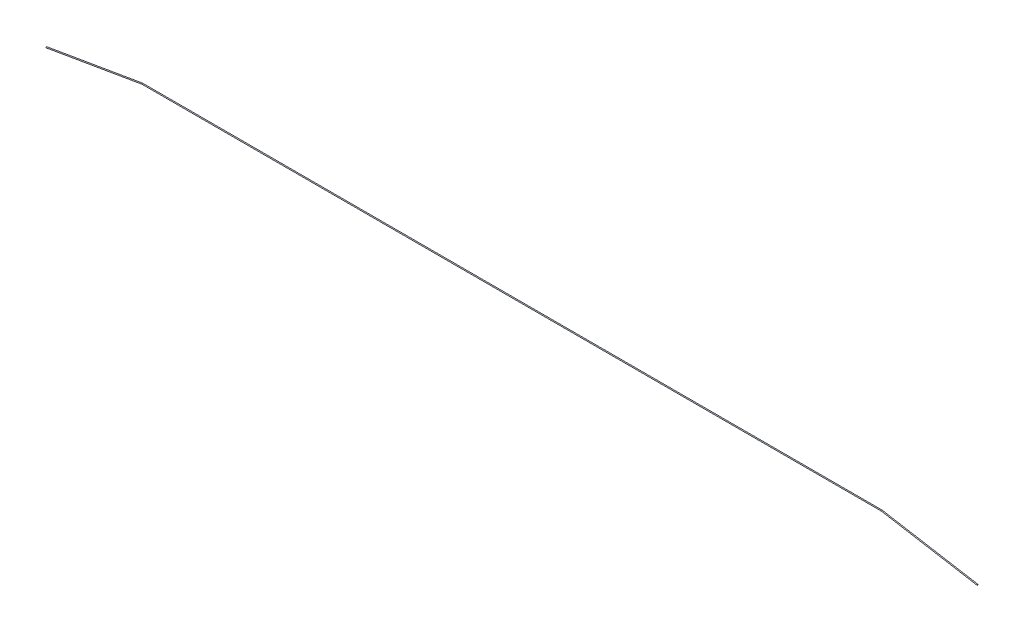
ISO-10303-21;
HEADER;
FILE_DESCRIPTION(('STEP AP214'),'2;1');
FILE_NAME('part.step','',(''),(''),'','','');
FILE_SCHEMA(('AUTOMOTIVE_DESIGN { 1 0 10303 214 1 1 1 1 }'));
ENDSEC;
DATA;
#1=APPLICATION_CONTEXT('core data for automotive mechanical design processes');
#2=APPLICATION_PROTOCOL_DEFINITION('international standard','automotive_design',2000,#1);
#3=PRODUCT_CONTEXT('',#1,'mechanical');
#4=PRODUCT('Part','Part','',(#3));
#5=PRODUCT_RELATED_PRODUCT_CATEGORY('part','',(#4));
#6=PRODUCT_DEFINITION_FORMATION('','',#4);
#7=PRODUCT_DEFINITION_CONTEXT('part definition',#1,'design');
#8=PRODUCT_DEFINITION('design','',#6,#7);
#9=PRODUCT_DEFINITION_SHAPE('','',#8);
#10=(LENGTH_UNIT() NAMED_UNIT(*) SI_UNIT(.MILLI.,.METRE.));
#11=(NAMED_UNIT(*) PLANE_ANGLE_UNIT() SI_UNIT($,.RADIAN.));
#12=(NAMED_UNIT(*) SI_UNIT($,.STERADIAN.) SOLID_ANGLE_UNIT());
#13=UNCERTAINTY_MEASURE_WITH_UNIT(LENGTH_MEASURE(1.E-05),#10,'distance_accuracy_value','');
#14=(GEOMETRIC_REPRESENTATION_CONTEXT(3) GLOBAL_UNCERTAINTY_ASSIGNED_CONTEXT((#13)) GLOBAL_UNIT_ASSIGNED_CONTEXT((#10,
#11,#12)) REPRESENTATION_CONTEXT('',''));
#15=CARTESIAN_POINT('',(0.,0.,0.));
#16=DIRECTION('',(0.,0.,1.));
#17=DIRECTION('',(1.,0.,0.));
#18=AXIS2_PLACEMENT_3D('',#15,#16,#17);
#19=CARTESIAN_POINT('',(-25.5905,22.225,0.));
#20=DIRECTION('',(0.985722753293324,0.168376523422446,0.));
#21=DIRECTION('',(-0.168376523422446,0.985722753293324,0.));
#22=AXIS2_PLACEMENT_3D('',#19,#20,#21);
#23=PLANE('',#22);
#24=CARTESIAN_POINT('',(-25.5905,22.225,0.));
#25=DIRECTION('',(0.985722753293324,0.168376523422446,0.));
#26=DIRECTION('',(-0.168376523422446,0.985722753293324,0.));
#27=AXIS2_PLACEMENT_3D('',#24,#25,#26);
#28=CIRCLE('',#27,0.0254);
#29=CARTESIAN_POINT('',(-25.5947767636949,22.2500373579337,0.));
#30=VERTEX_POINT('',#29);
#31=EDGE_CURVE('E60',#30,#30,#28,.T.);
#32=ORIENTED_EDGE('',*,*,#31,.F.);
#33=EDGE_LOOP('',(#32));
#34=FACE_BOUND('',#33,.T.);
#35=ADVANCED_FACE('F45',(#34),#23,.F.);
#36=CARTESIAN_POINT('',(25.5905,22.225,0.));
#37=DIRECTION('',(0.985722753293324,-0.168376523422448,0.));
#38=DIRECTION('',(0.168376523422448,0.985722753293324,0.));
#39=AXIS2_PLACEMENT_3D('',#36,#37,#38);
#40=PLANE('',#39);
#41=CARTESIAN_POINT('',(25.5905,22.225,0.));
#42=DIRECTION('',(0.985722753293324,-0.168376523422448,0.));
#43=DIRECTION('',(0.168376523422448,0.985722753293324,0.));
#44=AXIS2_PLACEMENT_3D('',#41,#42,#43);
#45=CIRCLE('',#44,0.0254);
#46=CARTESIAN_POINT('',(25.5947767636949,22.2500373579337,0.));
#47=VERTEX_POINT('',#46);
#48=EDGE_CURVE('E54',#47,#47,#45,.T.);
#49=ORIENTED_EDGE('',*,*,#48,.T.);
#50=EDGE_LOOP('',(#49));
#51=FACE_BOUND('',#50,.T.);
#52=ADVANCED_FACE('F123',(#51),#40,.T.);
#53=CARTESIAN_POINT('',(-20.32,23.1252820151337,0.));
#54=DIRECTION('',(-0.985722753293323,-0.168376523422447,0.));
#55=DIRECTION('',(0.168376523422447,-0.985722753293323,0.));
#56=AXIS2_PLACEMENT_3D('',#53,#54,#55);
#57=CYLINDRICAL_SURFACE('',#56,0.0254);
#58=ORIENTED_EDGE('',*,*,#31,.T.);
#59=EDGE_LOOP('',(#58));
#60=FACE_BOUND('',#59,.T.);
#61=CARTESIAN_POINT('',(-20.32,23.1252820151337,0.));
#62=DIRECTION('',(1.,0.,0.));
#63=DIRECTION('',(0.,1.,0.));
#64=AXIS2_PLACEMENT_3D('',#61,#62,#63);
#65=CIRCLE('',#64,0.0254);
#66=CARTESIAN_POINT('',(-20.3221383818475,23.1505006941005,0.));
#67=VERTEX_POINT('',#66);
#68=EDGE_CURVE('E48',#67,#67,#65,.T.);
#69=ORIENTED_EDGE('',*,*,#68,.F.);
#70=EDGE_LOOP('',(#69));
#71=FACE_BOUND('',#70,.T.);
#72=ADVANCED_FACE('F97',(#60,#71),#57,.T.);
#73=CARTESIAN_POINT('',(20.32,23.1252820151337,0.));
#74=DIRECTION('',(-1.,0.,0.));
#75=DIRECTION('',(0.,0.,1.));
#76=AXIS2_PLACEMENT_3D('',#73,#74,#75);
#77=CYLINDRICAL_SURFACE('',#76,0.0254);
#78=ORIENTED_EDGE('',*,*,#68,.T.);
#79=EDGE_LOOP('',(#78));
#80=FACE_BOUND('',#79,.T.);
#81=CARTESIAN_POINT('',(20.32,23.1252820151337,0.));
#82=DIRECTION('',(0.985722753293324,-0.168376523422448,0.));
#83=DIRECTION('',(0.168376523422448,0.985722753293324,0.));
#84=AXIS2_PLACEMENT_3D('',#81,#82,#83);
#85=CIRCLE('',#84,0.0254);
#86=CARTESIAN_POINT('',(20.3221383818475,23.1505006941005,0.));
#87=VERTEX_POINT('',#86);
#88=EDGE_CURVE('E12',#87,#87,#85,.T.);
#89=ORIENTED_EDGE('',*,*,#88,.F.);
#90=EDGE_LOOP('',(#89));
#91=FACE_BOUND('',#90,.T.);
#92=ADVANCED_FACE('F93',(#80,#91),#77,.T.);
#93=CARTESIAN_POINT('',(25.5905,22.225,0.));
#94=DIRECTION('',(-0.985722753293323,0.168376523422447,0.));
#95=DIRECTION('',(-0.168376523422447,-0.985722753293323,0.));
#96=AXIS2_PLACEMENT_3D('',#93,#94,#95);
#97=CYLINDRICAL_SURFACE('',#96,0.0254);
#98=ORIENTED_EDGE('',*,*,#88,.T.);
#99=EDGE_LOOP('',(#98));
#100=FACE_BOUND('',#99,.T.);
#101=ORIENTED_EDGE('',*,*,#48,.F.);
#102=EDGE_LOOP('',(#101));
#103=FACE_BOUND('',#102,.T.);
#104=ADVANCED_FACE('F73',(#100,#103),#97,.T.);
#105=CLOSED_SHELL('',(#35,#52,#72,#92,#104));
#106=MANIFOLD_SOLID_BREP('B2',#105);
#107=ADVANCED_BREP_SHAPE_REPRESENTATION('',(#18,#106),#14);
#108=SHAPE_DEFINITION_REPRESENTATION(#9,#107);
ENDSEC;
END-ISO-10303-21;
